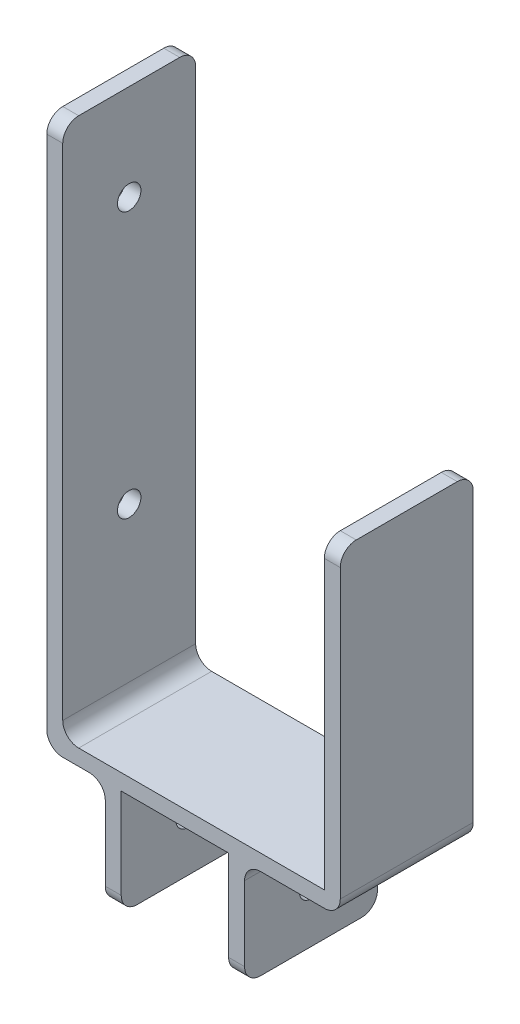
ISO-10303-21;
HEADER;
FILE_DESCRIPTION(('STEP AP214'),'2;1');
FILE_NAME('part.step','',(''),(''),'','','');
FILE_SCHEMA(('AUTOMOTIVE_DESIGN { 1 0 10303 214 1 1 1 1 }'));
ENDSEC;
DATA;
#1=APPLICATION_CONTEXT('core data for automotive mechanical design processes');
#2=APPLICATION_PROTOCOL_DEFINITION('international standard','automotive_design',2000,#1);
#3=PRODUCT_CONTEXT('',#1,'mechanical');
#4=PRODUCT('Part','Part','',(#3));
#5=PRODUCT_RELATED_PRODUCT_CATEGORY('part','',(#4));
#6=PRODUCT_DEFINITION_FORMATION('','',#4);
#7=PRODUCT_DEFINITION_CONTEXT('part definition',#1,'design');
#8=PRODUCT_DEFINITION('design','',#6,#7);
#9=PRODUCT_DEFINITION_SHAPE('','',#8);
#10=(LENGTH_UNIT() NAMED_UNIT(*) SI_UNIT(.MILLI.,.METRE.));
#11=(NAMED_UNIT(*) PLANE_ANGLE_UNIT() SI_UNIT($,.RADIAN.));
#12=(NAMED_UNIT(*) SI_UNIT($,.STERADIAN.) SOLID_ANGLE_UNIT());
#13=UNCERTAINTY_MEASURE_WITH_UNIT(LENGTH_MEASURE(1.E-05),#10,'distance_accuracy_value','');
#14=(GEOMETRIC_REPRESENTATION_CONTEXT(3) GLOBAL_UNCERTAINTY_ASSIGNED_CONTEXT((#13)) GLOBAL_UNIT_ASSIGNED_CONTEXT((#10,
#11,#12)) REPRESENTATION_CONTEXT('',''));
#15=CARTESIAN_POINT('',(0.,0.,0.));
#16=DIRECTION('',(0.,0.,1.));
#17=DIRECTION('',(1.,0.,0.));
#18=AXIS2_PLACEMENT_3D('',#15,#16,#17);
#19=CARTESIAN_POINT('',(-24.6,100.,25.));
#20=DIRECTION('',(-1.,0.,0.));
#21=DIRECTION('',(0.,-1.,0.));
#22=AXIS2_PLACEMENT_3D('',#19,#20,#21);
#23=PLANE('',#22);
#24=CARTESIAN_POINT('',(-24.6,32.,12.5));
#25=DIRECTION('',(-1.,0.,0.));
#26=DIRECTION('',(0.,-1.,0.));
#27=AXIS2_PLACEMENT_3D('',#24,#25,#26);
#28=CIRCLE('',#27,2.2);
#29=CARTESIAN_POINT('',(-24.6,29.8,12.5));
#30=VERTEX_POINT('',#29);
#31=EDGE_CURVE('E630',#30,#30,#28,.T.);
#32=ORIENTED_EDGE('',*,*,#31,.T.);
#33=EDGE_LOOP('',(#32));
#34=FACE_BOUND('',#33,.T.);
#35=CARTESIAN_POINT('',(-24.6,82.,12.5));
#36=DIRECTION('',(-1.,0.,0.));
#37=DIRECTION('',(0.,-1.,0.));
#38=AXIS2_PLACEMENT_3D('',#35,#36,#37);
#39=CIRCLE('',#38,2.2);
#40=CARTESIAN_POINT('',(-24.6,79.8,12.5));
#41=VERTEX_POINT('',#40);
#42=EDGE_CURVE('E276',#41,#41,#39,.T.);
#43=ORIENTED_EDGE('',*,*,#42,.T.);
#44=EDGE_LOOP('',(#43));
#45=FACE_BOUND('',#44,.T.);
#46=DIRECTION('',(0.,1.,0.));
#47=VECTOR('',#46,1.);
#48=CARTESIAN_POINT('',(-24.6,100.,25.));
#49=LINE('',#48,#47);
#50=CARTESIAN_POINT('',(-24.6,3.,25.));
#51=VERTEX_POINT('',#50);
#52=CARTESIAN_POINT('',(-24.6,97.,25.));
#53=VERTEX_POINT('',#52);
#54=EDGE_CURVE('E305',#51,#53,#49,.T.);
#55=ORIENTED_EDGE('',*,*,#54,.F.);
#56=DIRECTION('',(0.,0.,-1.));
#57=VECTOR('',#56,1.);
#58=CARTESIAN_POINT('',(-24.6,3.,0.));
#59=LINE('',#58,#57);
#60=CARTESIAN_POINT('',(-24.6,3.,0.));
#61=VERTEX_POINT('',#60);
#62=EDGE_CURVE('E414',#51,#61,#59,.T.);
#63=ORIENTED_EDGE('',*,*,#62,.T.);
#64=DIRECTION('',(0.,1.,0.));
#65=VECTOR('',#64,1.);
#66=CARTESIAN_POINT('',(-24.6,100.,0.));
#67=LINE('',#66,#65);
#68=CARTESIAN_POINT('',(-24.6,97.,0.));
#69=VERTEX_POINT('',#68);
#70=EDGE_CURVE('E272',#61,#69,#67,.T.);
#71=ORIENTED_EDGE('',*,*,#70,.T.);
#72=CARTESIAN_POINT('',(-24.6,97.,3.));
#73=DIRECTION('',(-1.,0.,0.));
#74=DIRECTION('',(0.,-1.,0.));
#75=AXIS2_PLACEMENT_3D('',#72,#73,#74);
#76=CIRCLE('',#75,3.);
#77=CARTESIAN_POINT('',(-24.6,100.,3.));
#78=VERTEX_POINT('',#77);
#79=EDGE_CURVE('E412',#69,#78,#76,.F.);
#80=ORIENTED_EDGE('',*,*,#79,.T.);
#81=DIRECTION('',(0.,0.,-1.));
#82=VECTOR('',#81,1.);
#83=CARTESIAN_POINT('',(-24.6,100.,25.));
#84=LINE('',#83,#82);
#85=CARTESIAN_POINT('',(-24.6,100.,22.));
#86=VERTEX_POINT('',#85);
#87=EDGE_CURVE('E327',#86,#78,#84,.T.);
#88=ORIENTED_EDGE('',*,*,#87,.F.);
#89=CARTESIAN_POINT('',(-24.6,97.,22.));
#90=DIRECTION('',(-1.,0.,0.));
#91=DIRECTION('',(0.,-1.,0.));
#92=AXIS2_PLACEMENT_3D('',#89,#90,#91);
#93=CIRCLE('',#92,3.);
#94=EDGE_CURVE('E410',#86,#53,#93,.F.);
#95=ORIENTED_EDGE('',*,*,#94,.T.);
#96=EDGE_LOOP('',(#55,#63,#71,#80,#88,#95));
#97=FACE_BOUND('',#96,.T.);
#98=ADVANCED_FACE('F32',(#34,#45,#97),#23,.F.);
#99=CARTESIAN_POINT('',(-27.6,100.,25.));
#100=DIRECTION('',(0.,-1.,0.));
#101=DIRECTION('',(0.,0.,-1.));
#102=AXIS2_PLACEMENT_3D('',#99,#100,#101);
#103=PLANE('',#102);
#104=ORIENTED_EDGE('',*,*,#87,.T.);
#105=DIRECTION('',(-1.,0.,0.));
#106=VECTOR('',#105,1.);
#107=CARTESIAN_POINT('',(-27.6,100.,3.));
#108=LINE('',#107,#106);
#109=CARTESIAN_POINT('',(-27.6,100.,3.));
#110=VERTEX_POINT('',#109);
#111=EDGE_CURVE('E427',#78,#110,#108,.T.);
#112=ORIENTED_EDGE('',*,*,#111,.T.);
#113=DIRECTION('',(0.,0.,-1.));
#114=VECTOR('',#113,1.);
#115=CARTESIAN_POINT('',(-27.6,100.,25.));
#116=LINE('',#115,#114);
#117=CARTESIAN_POINT('',(-27.6,100.,22.));
#118=VERTEX_POINT('',#117);
#119=EDGE_CURVE('E324',#118,#110,#116,.T.);
#120=ORIENTED_EDGE('',*,*,#119,.F.);
#121=DIRECTION('',(-1.,0.,0.));
#122=VECTOR('',#121,1.);
#123=CARTESIAN_POINT('',(-24.6,100.,22.));
#124=LINE('',#123,#122);
#125=EDGE_CURVE('E425',#118,#86,#124,.F.);
#126=ORIENTED_EDGE('',*,*,#125,.T.);
#127=EDGE_LOOP('',(#104,#112,#120,#126));
#128=FACE_BOUND('',#127,.T.);
#129=ADVANCED_FACE('F544',(#128),#103,.F.);
#130=CARTESIAN_POINT('',(-27.6,-3.,25.));
#131=DIRECTION('',(1.,0.,0.));
#132=DIRECTION('',(0.,1.,0.));
#133=AXIS2_PLACEMENT_3D('',#130,#131,#132);
#134=PLANE('',#133);
#135=CARTESIAN_POINT('',(-27.6,32.,12.5));
#136=DIRECTION('',(-1.,0.,0.));
#137=DIRECTION('',(0.,-1.,0.));
#138=AXIS2_PLACEMENT_3D('',#135,#136,#137);
#139=CIRCLE('',#138,2.2);
#140=CARTESIAN_POINT('',(-27.6,29.8,12.5));
#141=VERTEX_POINT('',#140);
#142=EDGE_CURVE('E625',#141,#141,#139,.T.);
#143=ORIENTED_EDGE('',*,*,#142,.F.);
#144=EDGE_LOOP('',(#143));
#145=FACE_BOUND('',#144,.T.);
#146=CARTESIAN_POINT('',(-27.6,82.,12.5));
#147=DIRECTION('',(-1.,0.,0.));
#148=DIRECTION('',(0.,-1.,0.));
#149=AXIS2_PLACEMENT_3D('',#146,#147,#148);
#150=CIRCLE('',#149,2.2);
#151=CARTESIAN_POINT('',(-27.6,79.8,12.5));
#152=VERTEX_POINT('',#151);
#153=EDGE_CURVE('E628',#152,#152,#150,.T.);
#154=ORIENTED_EDGE('',*,*,#153,.F.);
#155=EDGE_LOOP('',(#154));
#156=FACE_BOUND('',#155,.T.);
#157=DIRECTION('',(0.,-1.,0.));
#158=VECTOR('',#157,1.);
#159=CARTESIAN_POINT('',(-27.6,-3.,0.));
#160=LINE('',#159,#158);
#161=CARTESIAN_POINT('',(-27.6,97.,0.));
#162=VERTEX_POINT('',#161);
#163=CARTESIAN_POINT('',(-27.6,0.,0.));
#164=VERTEX_POINT('',#163);
#165=EDGE_CURVE('E275',#162,#164,#160,.T.);
#166=ORIENTED_EDGE('',*,*,#165,.T.);
#167=DIRECTION('',(0.,0.,-1.));
#168=VECTOR('',#167,1.);
#169=CARTESIAN_POINT('',(-27.6,0.,25.));
#170=LINE('',#169,#168);
#171=CARTESIAN_POINT('',(-27.6,0.,25.));
#172=VERTEX_POINT('',#171);
#173=EDGE_CURVE('E408',#164,#172,#170,.F.);
#174=ORIENTED_EDGE('',*,*,#173,.T.);
#175=DIRECTION('',(0.,-1.,0.));
#176=VECTOR('',#175,1.);
#177=CARTESIAN_POINT('',(-27.6,-3.,25.));
#178=LINE('',#177,#176);
#179=CARTESIAN_POINT('',(-27.6,97.,25.));
#180=VERTEX_POINT('',#179);
#181=EDGE_CURVE('E459',#180,#172,#178,.T.);
#182=ORIENTED_EDGE('',*,*,#181,.F.);
#183=CARTESIAN_POINT('',(-27.6,97.,22.));
#184=DIRECTION('',(1.,0.,0.));
#185=DIRECTION('',(0.,1.,0.));
#186=AXIS2_PLACEMENT_3D('',#183,#184,#185);
#187=CIRCLE('',#186,3.);
#188=EDGE_CURVE('E404',#180,#118,#187,.F.);
#189=ORIENTED_EDGE('',*,*,#188,.T.);
#190=ORIENTED_EDGE('',*,*,#119,.T.);
#191=CARTESIAN_POINT('',(-27.6,97.,3.));
#192=DIRECTION('',(1.,0.,0.));
#193=DIRECTION('',(0.,1.,0.));
#194=AXIS2_PLACEMENT_3D('',#191,#192,#193);
#195=CIRCLE('',#194,3.);
#196=EDGE_CURVE('E406',#110,#162,#195,.F.);
#197=ORIENTED_EDGE('',*,*,#196,.T.);
#198=EDGE_LOOP('',(#166,#174,#182,#189,#190,#197));
#199=FACE_BOUND('',#198,.T.);
#200=ADVANCED_FACE('F550',(#145,#156,#199),#134,.F.);
#201=CARTESIAN_POINT('',(-16.6,-3.,25.));
#202=DIRECTION('',(0.,1.,0.));
#203=DIRECTION('',(-1.,0.,0.));
#204=AXIS2_PLACEMENT_3D('',#201,#202,#203);
#205=PLANE('',#204);
#206=DIRECTION('',(1.,0.,0.));
#207=VECTOR('',#206,1.);
#208=CARTESIAN_POINT('',(-16.6,-3.,0.));
#209=LINE('',#208,#207);
#210=CARTESIAN_POINT('',(-24.6,-3.,0.));
#211=VERTEX_POINT('',#210);
#212=CARTESIAN_POINT('',(-19.6,-3.,0.));
#213=VERTEX_POINT('',#212);
#214=EDGE_CURVE('E279',#211,#213,#209,.T.);
#215=ORIENTED_EDGE('',*,*,#214,.T.);
#216=DIRECTION('',(0.,0.,-1.));
#217=VECTOR('',#216,1.);
#218=CARTESIAN_POINT('',(-19.6,-3.,25.));
#219=LINE('',#218,#217);
#220=CARTESIAN_POINT('',(-19.6,-3.,25.));
#221=VERTEX_POINT('',#220);
#222=EDGE_CURVE('E390',#213,#221,#219,.F.);
#223=ORIENTED_EDGE('',*,*,#222,.T.);
#224=DIRECTION('',(1.,0.,0.));
#225=VECTOR('',#224,1.);
#226=CARTESIAN_POINT('',(-16.6,-3.,25.));
#227=LINE('',#226,#225);
#228=CARTESIAN_POINT('',(-24.6,-3.,25.));
#229=VERTEX_POINT('',#228);
#230=EDGE_CURVE('E462',#229,#221,#227,.T.);
#231=ORIENTED_EDGE('',*,*,#230,.F.);
#232=DIRECTION('',(0.,0.,-1.));
#233=VECTOR('',#232,1.);
#234=CARTESIAN_POINT('',(-24.6,-3.,25.));
#235=LINE('',#234,#233);
#236=EDGE_CURVE('E387',#229,#211,#235,.T.);
#237=ORIENTED_EDGE('',*,*,#236,.T.);
#238=EDGE_LOOP('',(#215,#223,#231,#237));
#239=FACE_BOUND('',#238,.T.);
#240=ADVANCED_FACE('F603',(#239),#205,.F.);
#241=CARTESIAN_POINT('',(-16.6,-3.,25.));
#242=DIRECTION('',(1.,0.,0.));
#243=DIRECTION('',(0.,1.,0.));
#244=AXIS2_PLACEMENT_3D('',#241,#242,#243);
#245=PLANE('',#244);
#246=CARTESIAN_POINT('',(-16.6,-13.,12.5));
#247=DIRECTION('',(1.,0.,0.));
#248=DIRECTION('',(0.,1.,0.));
#249=AXIS2_PLACEMENT_3D('',#246,#247,#248);
#250=CIRCLE('',#249,2.2);
#251=CARTESIAN_POINT('',(-16.6,-10.8,12.5));
#252=VERTEX_POINT('',#251);
#253=EDGE_CURVE('E635',#252,#252,#250,.T.);
#254=ORIENTED_EDGE('',*,*,#253,.T.);
#255=EDGE_LOOP('',(#254));
#256=FACE_BOUND('',#255,.T.);
#257=DIRECTION('',(0.,-1.,0.));
#258=VECTOR('',#257,1.);
#259=CARTESIAN_POINT('',(-16.6,-3.,0.));
#260=LINE('',#259,#258);
#261=CARTESIAN_POINT('',(-16.6,-6.,0.));
#262=VERTEX_POINT('',#261);
#263=CARTESIAN_POINT('',(-16.6,-20.,0.));
#264=VERTEX_POINT('',#263);
#265=EDGE_CURVE('E282',#262,#264,#260,.T.);
#266=ORIENTED_EDGE('',*,*,#265,.T.);
#267=CARTESIAN_POINT('',(-16.6,-20.,3.));
#268=DIRECTION('',(1.,0.,0.));
#269=DIRECTION('',(0.,1.,0.));
#270=AXIS2_PLACEMENT_3D('',#267,#268,#269);
#271=CIRCLE('',#270,3.);
#272=CARTESIAN_POINT('',(-16.6,-23.,3.));
#273=VERTEX_POINT('',#272);
#274=EDGE_CURVE('E385',#264,#273,#271,.F.);
#275=ORIENTED_EDGE('',*,*,#274,.T.);
#276=DIRECTION('',(0.,0.,-1.));
#277=VECTOR('',#276,1.);
#278=CARTESIAN_POINT('',(-16.6,-23.,25.));
#279=LINE('',#278,#277);
#280=CARTESIAN_POINT('',(-16.6,-23.,22.));
#281=VERTEX_POINT('',#280);
#282=EDGE_CURVE('E321',#281,#273,#279,.T.);
#283=ORIENTED_EDGE('',*,*,#282,.F.);
#284=CARTESIAN_POINT('',(-16.6,-20.,22.));
#285=DIRECTION('',(1.,0.,0.));
#286=DIRECTION('',(0.,1.,0.));
#287=AXIS2_PLACEMENT_3D('',#284,#285,#286);
#288=CIRCLE('',#287,3.);
#289=CARTESIAN_POINT('',(-16.6,-20.,25.));
#290=VERTEX_POINT('',#289);
#291=EDGE_CURVE('E383',#281,#290,#288,.F.);
#292=ORIENTED_EDGE('',*,*,#291,.T.);
#293=DIRECTION('',(0.,-1.,0.));
#294=VECTOR('',#293,1.);
#295=CARTESIAN_POINT('',(-16.6,-3.,25.));
#296=LINE('',#295,#294);
#297=CARTESIAN_POINT('',(-16.6,-6.,25.));
#298=VERTEX_POINT('',#297);
#299=EDGE_CURVE('E236',#298,#290,#296,.T.);
#300=ORIENTED_EDGE('',*,*,#299,.F.);
#301=DIRECTION('',(0.,0.,-1.));
#302=VECTOR('',#301,1.);
#303=CARTESIAN_POINT('',(-16.6,-6.,0.));
#304=LINE('',#303,#302);
#305=EDGE_CURVE('E380',#298,#262,#304,.T.);
#306=ORIENTED_EDGE('',*,*,#305,.T.);
#307=EDGE_LOOP('',(#266,#275,#283,#292,#300,#306));
#308=FACE_BOUND('',#307,.T.);
#309=ADVANCED_FACE('F606',(#256,#308),#245,.F.);
#310=CARTESIAN_POINT('',(-16.6,-23.,25.));
#311=DIRECTION('',(0.,1.,0.));
#312=DIRECTION('',(-1.,0.,0.));
#313=AXIS2_PLACEMENT_3D('',#310,#311,#312);
#314=PLANE('',#313);
#315=ORIENTED_EDGE('',*,*,#282,.T.);
#316=DIRECTION('',(1.,0.,0.));
#317=VECTOR('',#316,1.);
#318=CARTESIAN_POINT('',(-16.6,-23.,3.));
#319=LINE('',#318,#317);
#320=CARTESIAN_POINT('',(-13.6,-23.,3.));
#321=VERTEX_POINT('',#320);
#322=EDGE_CURVE('E373',#273,#321,#319,.T.);
#323=ORIENTED_EDGE('',*,*,#322,.T.);
#324=DIRECTION('',(0.,0.,-1.));
#325=VECTOR('',#324,1.);
#326=CARTESIAN_POINT('',(-13.6,-23.,25.));
#327=LINE('',#326,#325);
#328=CARTESIAN_POINT('',(-13.6,-23.,22.));
#329=VERTEX_POINT('',#328);
#330=EDGE_CURVE('E246',#329,#321,#327,.T.);
#331=ORIENTED_EDGE('',*,*,#330,.F.);
#332=DIRECTION('',(1.,0.,0.));
#333=VECTOR('',#332,1.);
#334=CARTESIAN_POINT('',(-16.6,-23.,22.));
#335=LINE('',#334,#333);
#336=EDGE_CURVE('E371',#329,#281,#335,.F.);
#337=ORIENTED_EDGE('',*,*,#336,.T.);
#338=EDGE_LOOP('',(#315,#323,#331,#337));
#339=FACE_BOUND('',#338,.T.);
#340=ADVANCED_FACE('F478',(#339),#314,.F.);
#341=CARTESIAN_POINT('',(-13.6,-23.,25.));
#342=DIRECTION('',(-1.,0.,0.));
#343=DIRECTION('',(0.,-1.,0.));
#344=AXIS2_PLACEMENT_3D('',#341,#342,#343);
#345=PLANE('',#344);
#346=CARTESIAN_POINT('',(-13.6,-13.,12.5));
#347=DIRECTION('',(-1.,0.,0.));
#348=DIRECTION('',(0.,-1.,0.));
#349=AXIS2_PLACEMENT_3D('',#346,#347,#348);
#350=CIRCLE('',#349,2.2);
#351=CARTESIAN_POINT('',(-13.6,-15.2,12.5));
#352=VERTEX_POINT('',#351);
#353=EDGE_CURVE('E637',#352,#352,#350,.T.);
#354=ORIENTED_EDGE('',*,*,#353,.T.);
#355=EDGE_LOOP('',(#354));
#356=FACE_BOUND('',#355,.T.);
#357=ORIENTED_EDGE('',*,*,#330,.T.);
#358=CARTESIAN_POINT('',(-13.6,-20.,3.));
#359=DIRECTION('',(-1.,0.,0.));
#360=DIRECTION('',(0.,-1.,0.));
#361=AXIS2_PLACEMENT_3D('',#358,#359,#360);
#362=CIRCLE('',#361,3.);
#363=CARTESIAN_POINT('',(-13.6,-20.,0.));
#364=VERTEX_POINT('',#363);
#365=EDGE_CURVE('E378',#321,#364,#362,.F.);
#366=ORIENTED_EDGE('',*,*,#365,.T.);
#367=DIRECTION('',(0.,1.,0.));
#368=VECTOR('',#367,1.);
#369=CARTESIAN_POINT('',(-13.6,-23.,0.));
#370=LINE('',#369,#368);
#371=CARTESIAN_POINT('',(-13.6,-3.,0.));
#372=VERTEX_POINT('',#371);
#373=EDGE_CURVE('E243',#364,#372,#370,.T.);
#374=ORIENTED_EDGE('',*,*,#373,.T.);
#375=DIRECTION('',(0.,0.,-1.));
#376=VECTOR('',#375,1.);
#377=CARTESIAN_POINT('',(-13.6,-3.,25.));
#378=LINE('',#377,#376);
#379=CARTESIAN_POINT('',(-13.6,-3.,25.));
#380=VERTEX_POINT('',#379);
#381=EDGE_CURVE('E239',#380,#372,#378,.T.);
#382=ORIENTED_EDGE('',*,*,#381,.F.);
#383=DIRECTION('',(0.,1.,0.));
#384=VECTOR('',#383,1.);
#385=CARTESIAN_POINT('',(-13.6,-23.,25.));
#386=LINE('',#385,#384);
#387=CARTESIAN_POINT('',(-13.6,-20.,25.));
#388=VERTEX_POINT('',#387);
#389=EDGE_CURVE('E225',#388,#380,#386,.T.);
#390=ORIENTED_EDGE('',*,*,#389,.F.);
#391=CARTESIAN_POINT('',(-13.6,-20.,22.));
#392=DIRECTION('',(-1.,0.,0.));
#393=DIRECTION('',(0.,-1.,0.));
#394=AXIS2_PLACEMENT_3D('',#391,#392,#393);
#395=CIRCLE('',#394,3.);
#396=EDGE_CURVE('E376',#388,#329,#395,.F.);
#397=ORIENTED_EDGE('',*,*,#396,.T.);
#398=EDGE_LOOP('',(#357,#366,#374,#382,#390,#397));
#399=FACE_BOUND('',#398,.T.);
#400=ADVANCED_FACE('F241',(#356,#399),#345,.F.);
#401=CARTESIAN_POINT('',(6.59999999999999,-3.,25.));
#402=DIRECTION('',(0.,1.,0.));
#403=DIRECTION('',(-1.,0.,0.));
#404=AXIS2_PLACEMENT_3D('',#401,#402,#403);
#405=PLANE('',#404);
#406=DIRECTION('',(1.,0.,0.));
#407=VECTOR('',#406,1.);
#408=CARTESIAN_POINT('',(6.59999999999999,-3.,0.));
#409=LINE('',#408,#407);
#410=CARTESIAN_POINT('',(6.59999999999999,-3.,0.));
#411=VERTEX_POINT('',#410);
#412=EDGE_CURVE('E286',#372,#411,#409,.T.);
#413=ORIENTED_EDGE('',*,*,#412,.T.);
#414=DIRECTION('',(0.,0.,-1.));
#415=VECTOR('',#414,1.);
#416=CARTESIAN_POINT('',(6.59999999999999,-3.,25.));
#417=LINE('',#416,#415);
#418=CARTESIAN_POINT('',(6.59999999999999,-3.,25.));
#419=VERTEX_POINT('',#418);
#420=EDGE_CURVE('E247',#419,#411,#417,.T.);
#421=ORIENTED_EDGE('',*,*,#420,.F.);
#422=DIRECTION('',(1.,0.,0.));
#423=VECTOR('',#422,1.);
#424=CARTESIAN_POINT('',(6.59999999999999,-3.,25.));
#425=LINE('',#424,#423);
#426=EDGE_CURVE('E230',#380,#419,#425,.T.);
#427=ORIENTED_EDGE('',*,*,#426,.F.);
#428=ORIENTED_EDGE('',*,*,#381,.T.);
#429=EDGE_LOOP('',(#413,#421,#427,#428));
#430=FACE_BOUND('',#429,.T.);
#431=ADVANCED_FACE('F249',(#430),#405,.F.);
#432=CARTESIAN_POINT('',(6.59999999999999,-3.,25.));
#433=DIRECTION('',(1.,0.,0.));
#434=DIRECTION('',(0.,1.,0.));
#435=AXIS2_PLACEMENT_3D('',#432,#433,#434);
#436=PLANE('',#435);
#437=CARTESIAN_POINT('',(6.59999999999999,-13.,12.5));
#438=DIRECTION('',(1.,0.,0.));
#439=DIRECTION('',(0.,1.,0.));
#440=AXIS2_PLACEMENT_3D('',#437,#438,#439);
#441=CIRCLE('',#440,2.2);
#442=CARTESIAN_POINT('',(6.59999999999999,-10.8,12.5));
#443=VERTEX_POINT('',#442);
#444=EDGE_CURVE('E640',#443,#443,#441,.T.);
#445=ORIENTED_EDGE('',*,*,#444,.T.);
#446=EDGE_LOOP('',(#445));
#447=FACE_BOUND('',#446,.T.);
#448=DIRECTION('',(0.,0.,-1.));
#449=VECTOR('',#448,1.);
#450=CARTESIAN_POINT('',(6.6,-23.,25.));
#451=LINE('',#450,#449);
#452=CARTESIAN_POINT('',(6.6,-23.,22.));
#453=VERTEX_POINT('',#452);
#454=CARTESIAN_POINT('',(6.6,-23.,3.));
#455=VERTEX_POINT('',#454);
#456=EDGE_CURVE('E316',#453,#455,#451,.T.);
#457=ORIENTED_EDGE('',*,*,#456,.F.);
#458=CARTESIAN_POINT('',(6.6,-20.,22.));
#459=DIRECTION('',(1.,0.,0.));
#460=DIRECTION('',(0.,1.,0.));
#461=AXIS2_PLACEMENT_3D('',#458,#459,#460);
#462=CIRCLE('',#461,3.);
#463=CARTESIAN_POINT('',(6.6,-20.,25.));
#464=VERTEX_POINT('',#463);
#465=EDGE_CURVE('E357',#453,#464,#462,.F.);
#466=ORIENTED_EDGE('',*,*,#465,.T.);
#467=DIRECTION('',(0.,-1.,0.));
#468=VECTOR('',#467,1.);
#469=CARTESIAN_POINT('',(6.59999999999999,-3.,25.));
#470=LINE('',#469,#468);
#471=EDGE_CURVE('E252',#419,#464,#470,.T.);
#472=ORIENTED_EDGE('',*,*,#471,.F.);
#473=ORIENTED_EDGE('',*,*,#420,.T.);
#474=DIRECTION('',(0.,-1.,0.));
#475=VECTOR('',#474,1.);
#476=CARTESIAN_POINT('',(6.59999999999999,-3.,0.));
#477=LINE('',#476,#475);
#478=CARTESIAN_POINT('',(6.6,-20.,0.));
#479=VERTEX_POINT('',#478);
#480=EDGE_CURVE('E288',#411,#479,#477,.T.);
#481=ORIENTED_EDGE('',*,*,#480,.T.);
#482=CARTESIAN_POINT('',(6.6,-20.,3.));
#483=DIRECTION('',(1.,0.,0.));
#484=DIRECTION('',(0.,1.,0.));
#485=AXIS2_PLACEMENT_3D('',#482,#483,#484);
#486=CIRCLE('',#485,3.);
#487=EDGE_CURVE('E355',#479,#455,#486,.F.);
#488=ORIENTED_EDGE('',*,*,#487,.T.);
#489=EDGE_LOOP('',(#457,#466,#472,#473,#481,#488));
#490=FACE_BOUND('',#489,.T.);
#491=ADVANCED_FACE('F489',(#447,#490),#436,.F.);
#492=CARTESIAN_POINT('',(6.6,-23.,25.));
#493=DIRECTION('',(0.,1.,0.));
#494=DIRECTION('',(0.,0.,1.));
#495=AXIS2_PLACEMENT_3D('',#492,#493,#494);
#496=PLANE('',#495);
#497=DIRECTION('',(0.,0.,-1.));
#498=VECTOR('',#497,1.);
#499=CARTESIAN_POINT('',(9.6,-23.,25.));
#500=LINE('',#499,#498);
#501=CARTESIAN_POINT('',(9.6,-23.,22.));
#502=VERTEX_POINT('',#501);
#503=CARTESIAN_POINT('',(9.6,-23.,3.));
#504=VERTEX_POINT('',#503);
#505=EDGE_CURVE('E313',#502,#504,#500,.T.);
#506=ORIENTED_EDGE('',*,*,#505,.F.);
#507=DIRECTION('',(1.,0.,0.));
#508=VECTOR('',#507,1.);
#509=CARTESIAN_POINT('',(6.6,-23.,22.));
#510=LINE('',#509,#508);
#511=EDGE_CURVE('E353',#502,#453,#510,.F.);
#512=ORIENTED_EDGE('',*,*,#511,.T.);
#513=ORIENTED_EDGE('',*,*,#456,.T.);
#514=DIRECTION('',(1.,0.,0.));
#515=VECTOR('',#514,1.);
#516=CARTESIAN_POINT('',(6.6,-23.,3.));
#517=LINE('',#516,#515);
#518=EDGE_CURVE('E350',#455,#504,#517,.T.);
#519=ORIENTED_EDGE('',*,*,#518,.T.);
#520=EDGE_LOOP('',(#506,#512,#513,#519));
#521=FACE_BOUND('',#520,.T.);
#522=ADVANCED_FACE('F501',(#521),#496,.F.);
#523=CARTESIAN_POINT('',(9.6,-23.,25.));
#524=DIRECTION('',(-1.,0.,0.));
#525=DIRECTION('',(0.,-1.,0.));
#526=AXIS2_PLACEMENT_3D('',#523,#524,#525);
#527=PLANE('',#526);
#528=CARTESIAN_POINT('',(9.6,-13.,12.5));
#529=DIRECTION('',(-1.,0.,0.));
#530=DIRECTION('',(0.,-1.,0.));
#531=AXIS2_PLACEMENT_3D('',#528,#529,#530);
#532=CIRCLE('',#531,2.2);
#533=CARTESIAN_POINT('',(9.6,-15.2,12.5));
#534=VERTEX_POINT('',#533);
#535=EDGE_CURVE('E36',#534,#534,#532,.T.);
#536=ORIENTED_EDGE('',*,*,#535,.T.);
#537=EDGE_LOOP('',(#536));
#538=FACE_BOUND('',#537,.T.);
#539=DIRECTION('',(0.,1.,0.));
#540=VECTOR('',#539,1.);
#541=CARTESIAN_POINT('',(9.6,-23.,25.));
#542=LINE('',#541,#540);
#543=CARTESIAN_POINT('',(9.6,-20.,25.));
#544=VERTEX_POINT('',#543);
#545=CARTESIAN_POINT('',(9.59999999999999,-6.,25.));
#546=VERTEX_POINT('',#545);
#547=EDGE_CURVE('E254',#544,#546,#542,.T.);
#548=ORIENTED_EDGE('',*,*,#547,.F.);
#549=CARTESIAN_POINT('',(9.6,-20.,22.));
#550=DIRECTION('',(-1.,0.,0.));
#551=DIRECTION('',(0.,-1.,0.));
#552=AXIS2_PLACEMENT_3D('',#549,#550,#551);
#553=CIRCLE('',#552,3.);
#554=EDGE_CURVE('E348',#544,#502,#553,.F.);
#555=ORIENTED_EDGE('',*,*,#554,.T.);
#556=ORIENTED_EDGE('',*,*,#505,.T.);
#557=CARTESIAN_POINT('',(9.6,-20.,3.));
#558=DIRECTION('',(-1.,0.,0.));
#559=DIRECTION('',(0.,-1.,0.));
#560=AXIS2_PLACEMENT_3D('',#557,#558,#559);
#561=CIRCLE('',#560,3.);
#562=CARTESIAN_POINT('',(9.6,-20.,0.));
#563=VERTEX_POINT('',#562);
#564=EDGE_CURVE('E346',#504,#563,#561,.F.);
#565=ORIENTED_EDGE('',*,*,#564,.T.);
#566=DIRECTION('',(0.,1.,0.));
#567=VECTOR('',#566,1.);
#568=CARTESIAN_POINT('',(9.6,-23.,0.));
#569=LINE('',#568,#567);
#570=CARTESIAN_POINT('',(9.59999999999999,-6.,0.));
#571=VERTEX_POINT('',#570);
#572=EDGE_CURVE('E291',#563,#571,#569,.T.);
#573=ORIENTED_EDGE('',*,*,#572,.T.);
#574=DIRECTION('',(0.,0.,-1.));
#575=VECTOR('',#574,1.);
#576=CARTESIAN_POINT('',(9.59999999999999,-6.,25.));
#577=LINE('',#576,#575);
#578=EDGE_CURVE('E344',#571,#546,#577,.F.);
#579=ORIENTED_EDGE('',*,*,#578,.T.);
#580=EDGE_LOOP('',(#548,#555,#556,#565,#573,#579));
#581=FACE_BOUND('',#580,.T.);
#582=ADVANCED_FACE('F499',(#538,#581),#527,.F.);
#583=CARTESIAN_POINT('',(27.6,-3.,25.));
#584=DIRECTION('',(0.,1.,0.));
#585=DIRECTION('',(-1.,0.,0.));
#586=AXIS2_PLACEMENT_3D('',#583,#584,#585);
#587=PLANE('',#586);
#588=DIRECTION('',(1.,0.,0.));
#589=VECTOR('',#588,1.);
#590=CARTESIAN_POINT('',(27.6,-3.,25.));
#591=LINE('',#590,#589);
#592=CARTESIAN_POINT('',(12.6,-3.,25.));
#593=VERTEX_POINT('',#592);
#594=CARTESIAN_POINT('',(24.6,-3.,25.));
#595=VERTEX_POINT('',#594);
#596=EDGE_CURVE('E260',#593,#595,#591,.T.);
#597=ORIENTED_EDGE('',*,*,#596,.F.);
#598=DIRECTION('',(0.,0.,-1.));
#599=VECTOR('',#598,1.);
#600=CARTESIAN_POINT('',(12.6,-3.,0.));
#601=LINE('',#600,#599);
#602=CARTESIAN_POINT('',(12.6,-3.,0.));
#603=VERTEX_POINT('',#602);
#604=EDGE_CURVE('E394',#593,#603,#601,.T.);
#605=ORIENTED_EDGE('',*,*,#604,.T.);
#606=DIRECTION('',(1.,0.,0.));
#607=VECTOR('',#606,1.);
#608=CARTESIAN_POINT('',(27.6,-3.,0.));
#609=LINE('',#608,#607);
#610=CARTESIAN_POINT('',(24.6,-3.,0.));
#611=VERTEX_POINT('',#610);
#612=EDGE_CURVE('E294',#603,#611,#609,.T.);
#613=ORIENTED_EDGE('',*,*,#612,.T.);
#614=DIRECTION('',(0.,0.,-1.));
#615=VECTOR('',#614,1.);
#616=CARTESIAN_POINT('',(24.6,-3.,25.));
#617=LINE('',#616,#615);
#618=EDGE_CURVE('E392',#611,#595,#617,.F.);
#619=ORIENTED_EDGE('',*,*,#618,.T.);
#620=EDGE_LOOP('',(#597,#605,#613,#619));
#621=FACE_BOUND('',#620,.T.);
#622=ADVANCED_FACE('F514',(#621),#587,.F.);
#623=CARTESIAN_POINT('',(27.6,57.,25.));
#624=DIRECTION('',(-1.,0.,0.));
#625=DIRECTION('',(0.,-1.,0.));
#626=AXIS2_PLACEMENT_3D('',#623,#624,#625);
#627=PLANE('',#626);
#628=DIRECTION('',(0.,1.,0.));
#629=VECTOR('',#628,1.);
#630=CARTESIAN_POINT('',(27.6,57.,25.));
#631=LINE('',#630,#629);
#632=CARTESIAN_POINT('',(27.6,0.,25.));
#633=VERTEX_POINT('',#632);
#634=CARTESIAN_POINT('',(27.6,54.,25.));
#635=VERTEX_POINT('',#634);
#636=EDGE_CURVE('E263',#633,#635,#631,.T.);
#637=ORIENTED_EDGE('',*,*,#636,.F.);
#638=DIRECTION('',(0.,0.,-1.));
#639=VECTOR('',#638,1.);
#640=CARTESIAN_POINT('',(27.6,0.,25.));
#641=LINE('',#640,#639);
#642=CARTESIAN_POINT('',(27.6,0.,0.));
#643=VERTEX_POINT('',#642);
#644=EDGE_CURVE('E401',#633,#643,#641,.T.);
#645=ORIENTED_EDGE('',*,*,#644,.T.);
#646=DIRECTION('',(0.,1.,0.));
#647=VECTOR('',#646,1.);
#648=CARTESIAN_POINT('',(27.6,57.,0.));
#649=LINE('',#648,#647);
#650=CARTESIAN_POINT('',(27.6,54.,0.));
#651=VERTEX_POINT('',#650);
#652=EDGE_CURVE('E297',#643,#651,#649,.T.);
#653=ORIENTED_EDGE('',*,*,#652,.T.);
#654=CARTESIAN_POINT('',(27.6,54.,3.));
#655=DIRECTION('',(-1.,0.,0.));
#656=DIRECTION('',(0.,-1.,0.));
#657=AXIS2_PLACEMENT_3D('',#654,#655,#656);
#658=CIRCLE('',#657,3.);
#659=CARTESIAN_POINT('',(27.6,57.,3.));
#660=VERTEX_POINT('',#659);
#661=EDGE_CURVE('E399',#651,#660,#658,.F.);
#662=ORIENTED_EDGE('',*,*,#661,.T.);
#663=DIRECTION('',(0.,0.,-1.));
#664=VECTOR('',#663,1.);
#665=CARTESIAN_POINT('',(27.6,57.,25.));
#666=LINE('',#665,#664);
#667=CARTESIAN_POINT('',(27.6,57.,22.));
#668=VERTEX_POINT('',#667);
#669=EDGE_CURVE('E310',#668,#660,#666,.T.);
#670=ORIENTED_EDGE('',*,*,#669,.F.);
#671=CARTESIAN_POINT('',(27.6,54.,22.));
#672=DIRECTION('',(-1.,0.,0.));
#673=DIRECTION('',(0.,-1.,0.));
#674=AXIS2_PLACEMENT_3D('',#671,#672,#673);
#675=CIRCLE('',#674,3.);
#676=EDGE_CURVE('E397',#668,#635,#675,.F.);
#677=ORIENTED_EDGE('',*,*,#676,.T.);
#678=EDGE_LOOP('',(#637,#645,#653,#662,#670,#677));
#679=FACE_BOUND('',#678,.T.);
#680=ADVANCED_FACE('F523',(#679),#627,.F.);
#681=CARTESIAN_POINT('',(24.6,57.,25.));
#682=DIRECTION('',(0.,-1.,0.));
#683=DIRECTION('',(0.,0.,-1.));
#684=AXIS2_PLACEMENT_3D('',#681,#682,#683);
#685=PLANE('',#684);
#686=ORIENTED_EDGE('',*,*,#669,.T.);
#687=DIRECTION('',(-1.,0.,0.));
#688=VECTOR('',#687,1.);
#689=CARTESIAN_POINT('',(24.6,57.,3.));
#690=LINE('',#689,#688);
#691=CARTESIAN_POINT('',(24.6,57.,3.));
#692=VERTEX_POINT('',#691);
#693=EDGE_CURVE('E421',#660,#692,#690,.T.);
#694=ORIENTED_EDGE('',*,*,#693,.T.);
#695=DIRECTION('',(0.,0.,-1.));
#696=VECTOR('',#695,1.);
#697=CARTESIAN_POINT('',(24.6,57.,25.));
#698=LINE('',#697,#696);
#699=CARTESIAN_POINT('',(24.6,57.,22.));
#700=VERTEX_POINT('',#699);
#701=EDGE_CURVE('E308',#700,#692,#698,.T.);
#702=ORIENTED_EDGE('',*,*,#701,.F.);
#703=DIRECTION('',(-1.,0.,0.));
#704=VECTOR('',#703,1.);
#705=CARTESIAN_POINT('',(27.6,57.,22.));
#706=LINE('',#705,#704);
#707=EDGE_CURVE('E419',#700,#668,#706,.F.);
#708=ORIENTED_EDGE('',*,*,#707,.T.);
#709=EDGE_LOOP('',(#686,#694,#702,#708));
#710=FACE_BOUND('',#709,.T.);
#711=ADVANCED_FACE('F529',(#710),#685,.F.);
#712=CARTESIAN_POINT('',(24.6,0.,25.));
#713=DIRECTION('',(1.,0.,0.));
#714=DIRECTION('',(0.,1.,0.));
#715=AXIS2_PLACEMENT_3D('',#712,#713,#714);
#716=PLANE('',#715);
#717=ORIENTED_EDGE('',*,*,#701,.T.);
#718=CARTESIAN_POINT('',(24.6,54.,3.));
#719=DIRECTION('',(1.,0.,0.));
#720=DIRECTION('',(0.,1.,0.));
#721=AXIS2_PLACEMENT_3D('',#718,#719,#720);
#722=CIRCLE('',#721,3.);
#723=CARTESIAN_POINT('',(24.6,54.,0.));
#724=VERTEX_POINT('',#723);
#725=EDGE_CURVE('E48',#692,#724,#722,.F.);
#726=ORIENTED_EDGE('',*,*,#725,.T.);
#727=DIRECTION('',(0.,-1.,0.));
#728=VECTOR('',#727,1.);
#729=CARTESIAN_POINT('',(24.6,0.,0.));
#730=LINE('',#729,#728);
#731=CARTESIAN_POINT('',(24.6,0.,0.));
#732=VERTEX_POINT('',#731);
#733=EDGE_CURVE('E300',#724,#732,#730,.T.);
#734=ORIENTED_EDGE('',*,*,#733,.T.);
#735=DIRECTION('',(0.,0.,-1.));
#736=VECTOR('',#735,1.);
#737=CARTESIAN_POINT('',(24.6,0.,25.));
#738=LINE('',#737,#736);
#739=CARTESIAN_POINT('',(24.6,0.,25.));
#740=VERTEX_POINT('',#739);
#741=EDGE_CURVE('E271',#740,#732,#738,.T.);
#742=ORIENTED_EDGE('',*,*,#741,.F.);
#743=DIRECTION('',(0.,-1.,0.));
#744=VECTOR('',#743,1.);
#745=CARTESIAN_POINT('',(24.6,0.,25.));
#746=LINE('',#745,#744);
#747=CARTESIAN_POINT('',(24.6,54.,25.));
#748=VERTEX_POINT('',#747);
#749=EDGE_CURVE('E266',#748,#740,#746,.T.);
#750=ORIENTED_EDGE('',*,*,#749,.F.);
#751=CARTESIAN_POINT('',(24.6,54.,22.));
#752=DIRECTION('',(1.,0.,0.));
#753=DIRECTION('',(0.,1.,0.));
#754=AXIS2_PLACEMENT_3D('',#751,#752,#753);
#755=CIRCLE('',#754,3.);
#756=EDGE_CURVE('E56',#748,#700,#755,.F.);
#757=ORIENTED_EDGE('',*,*,#756,.T.);
#758=EDGE_LOOP('',(#717,#726,#734,#742,#750,#757));
#759=FACE_BOUND('',#758,.T.);
#760=ADVANCED_FACE('F534',(#759),#716,.F.);
#761=CARTESIAN_POINT('',(-24.6,0.,25.));
#762=DIRECTION('',(0.,-1.,0.));
#763=DIRECTION('',(0.,0.,-1.));
#764=AXIS2_PLACEMENT_3D('',#761,#762,#763);
#765=PLANE('',#764);
#766=DIRECTION('',(-1.,0.,0.));
#767=VECTOR('',#766,1.);
#768=CARTESIAN_POINT('',(-24.6,0.,0.));
#769=LINE('',#768,#767);
#770=CARTESIAN_POINT('',(-21.6,0.,0.));
#771=VERTEX_POINT('',#770);
#772=EDGE_CURVE('E302',#732,#771,#769,.T.);
#773=ORIENTED_EDGE('',*,*,#772,.T.);
#774=DIRECTION('',(0.,0.,-1.));
#775=VECTOR('',#774,1.);
#776=CARTESIAN_POINT('',(-21.6,0.,25.));
#777=LINE('',#776,#775);
#778=CARTESIAN_POINT('',(-21.6,0.,25.));
#779=VERTEX_POINT('',#778);
#780=EDGE_CURVE('E417',#771,#779,#777,.F.);
#781=ORIENTED_EDGE('',*,*,#780,.T.);
#782=DIRECTION('',(-1.,0.,0.));
#783=VECTOR('',#782,1.);
#784=CARTESIAN_POINT('',(-24.6,0.,25.));
#785=LINE('',#784,#783);
#786=EDGE_CURVE('E268',#740,#779,#785,.T.);
#787=ORIENTED_EDGE('',*,*,#786,.F.);
#788=ORIENTED_EDGE('',*,*,#741,.T.);
#789=EDGE_LOOP('',(#773,#781,#787,#788));
#790=FACE_BOUND('',#789,.T.);
#791=ADVANCED_FACE('F448',(#790),#765,.F.);
#792=CARTESIAN_POINT('',(0.,0.,25.));
#793=DIRECTION('',(0.,0.,1.));
#794=DIRECTION('',(1.,0.,0.));
#795=AXIS2_PLACEMENT_3D('',#792,#793,#794);
#796=PLANE('',#795);
#797=ORIENTED_EDGE('',*,*,#471,.T.);
#798=DIRECTION('',(1.,0.,0.));
#799=VECTOR('',#798,1.);
#800=CARTESIAN_POINT('',(9.6,-20.,25.));
#801=LINE('',#800,#799);
#802=EDGE_CURVE('E341',#464,#544,#801,.T.);
#803=ORIENTED_EDGE('',*,*,#802,.T.);
#804=ORIENTED_EDGE('',*,*,#547,.T.);
#805=CARTESIAN_POINT('',(12.6,-6.,25.));
#806=DIRECTION('',(0.,0.,1.));
#807=DIRECTION('',(1.,0.,0.));
#808=AXIS2_PLACEMENT_3D('',#805,#806,#807);
#809=CIRCLE('',#808,3.);
#810=EDGE_CURVE('E436',#546,#593,#809,.F.);
#811=ORIENTED_EDGE('',*,*,#810,.T.);
#812=ORIENTED_EDGE('',*,*,#596,.T.);
#813=CARTESIAN_POINT('',(24.6,0.,25.));
#814=DIRECTION('',(0.,0.,1.));
#815=DIRECTION('',(1.,0.,0.));
#816=AXIS2_PLACEMENT_3D('',#813,#814,#815);
#817=CIRCLE('',#816,3.);
#818=EDGE_CURVE('E338',#595,#633,#817,.T.);
#819=ORIENTED_EDGE('',*,*,#818,.T.);
#820=ORIENTED_EDGE('',*,*,#636,.T.);
#821=DIRECTION('',(-1.,0.,0.));
#822=VECTOR('',#821,1.);
#823=CARTESIAN_POINT('',(24.6,54.,25.));
#824=LINE('',#823,#822);
#825=EDGE_CURVE('E333',#635,#748,#824,.T.);
#826=ORIENTED_EDGE('',*,*,#825,.T.);
#827=ORIENTED_EDGE('',*,*,#749,.T.);
#828=ORIENTED_EDGE('',*,*,#786,.T.);
#829=CARTESIAN_POINT('',(-21.6,3.,25.));
#830=DIRECTION('',(0.,0.,1.));
#831=DIRECTION('',(1.,0.,0.));
#832=AXIS2_PLACEMENT_3D('',#829,#830,#831);
#833=CIRCLE('',#832,3.);
#834=EDGE_CURVE('E11',#779,#51,#833,.F.);
#835=ORIENTED_EDGE('',*,*,#834,.T.);
#836=ORIENTED_EDGE('',*,*,#54,.T.);
#837=DIRECTION('',(-1.,0.,0.));
#838=VECTOR('',#837,1.);
#839=CARTESIAN_POINT('',(-27.6,97.,25.));
#840=LINE('',#839,#838);
#841=EDGE_CURVE('E330',#53,#180,#840,.T.);
#842=ORIENTED_EDGE('',*,*,#841,.T.);
#843=ORIENTED_EDGE('',*,*,#181,.T.);
#844=CARTESIAN_POINT('',(-24.6,0.,25.));
#845=DIRECTION('',(0.,0.,1.));
#846=DIRECTION('',(1.,0.,0.));
#847=AXIS2_PLACEMENT_3D('',#844,#845,#846);
#848=CIRCLE('',#847,3.);
#849=EDGE_CURVE('E336',#172,#229,#848,.T.);
#850=ORIENTED_EDGE('',*,*,#849,.T.);
#851=ORIENTED_EDGE('',*,*,#230,.T.);
#852=CARTESIAN_POINT('',(-19.6,-6.,25.));
#853=DIRECTION('',(0.,0.,1.));
#854=DIRECTION('',(1.,0.,0.));
#855=AXIS2_PLACEMENT_3D('',#852,#853,#854);
#856=CIRCLE('',#855,3.);
#857=EDGE_CURVE('E432',#221,#298,#856,.F.);
#858=ORIENTED_EDGE('',*,*,#857,.T.);
#859=ORIENTED_EDGE('',*,*,#299,.T.);
#860=DIRECTION('',(1.,0.,0.));
#861=VECTOR('',#860,1.);
#862=CARTESIAN_POINT('',(-13.6,-20.,25.));
#863=LINE('',#862,#861);
#864=EDGE_CURVE('E234',#290,#388,#863,.T.);
#865=ORIENTED_EDGE('',*,*,#864,.T.);
#866=ORIENTED_EDGE('',*,*,#389,.T.);
#867=ORIENTED_EDGE('',*,*,#426,.T.);
#868=EDGE_LOOP('',(#797,#803,#804,#811,#812,#819,#820,#826,#827,#828,#835,#836,#842,#843,#850,
#851,#858,#859,#865,#866,#867));
#869=FACE_BOUND('',#868,.T.);
#870=ADVANCED_FACE('F228',(#869),#796,.T.);
#871=CARTESIAN_POINT('',(0.,0.,0.));
#872=DIRECTION('',(0.,0.,1.));
#873=DIRECTION('',(1.,0.,0.));
#874=AXIS2_PLACEMENT_3D('',#871,#872,#873);
#875=PLANE('',#874);
#876=ORIENTED_EDGE('',*,*,#572,.F.);
#877=DIRECTION('',(1.,0.,0.));
#878=VECTOR('',#877,1.);
#879=CARTESIAN_POINT('',(0.,-20.,0.));
#880=LINE('',#879,#878);
#881=EDGE_CURVE('E369',#563,#479,#880,.F.);
#882=ORIENTED_EDGE('',*,*,#881,.T.);
#883=ORIENTED_EDGE('',*,*,#480,.F.);
#884=ORIENTED_EDGE('',*,*,#412,.F.);
#885=ORIENTED_EDGE('',*,*,#373,.F.);
#886=DIRECTION('',(1.,0.,0.));
#887=VECTOR('',#886,1.);
#888=CARTESIAN_POINT('',(0.,-20.,0.));
#889=LINE('',#888,#887);
#890=EDGE_CURVE('E367',#364,#264,#889,.F.);
#891=ORIENTED_EDGE('',*,*,#890,.T.);
#892=ORIENTED_EDGE('',*,*,#265,.F.);
#893=CARTESIAN_POINT('',(-19.6,-6.,0.));
#894=DIRECTION('',(0.,0.,1.));
#895=DIRECTION('',(1.,0.,0.));
#896=AXIS2_PLACEMENT_3D('',#893,#894,#895);
#897=CIRCLE('',#896,3.);
#898=EDGE_CURVE('E430',#262,#213,#897,.T.);
#899=ORIENTED_EDGE('',*,*,#898,.T.);
#900=ORIENTED_EDGE('',*,*,#214,.F.);
#901=CARTESIAN_POINT('',(-24.6,0.,0.));
#902=DIRECTION('',(0.,0.,1.));
#903=DIRECTION('',(1.,0.,0.));
#904=AXIS2_PLACEMENT_3D('',#901,#902,#903);
#905=CIRCLE('',#904,3.);
#906=EDGE_CURVE('E363',#211,#164,#905,.F.);
#907=ORIENTED_EDGE('',*,*,#906,.T.);
#908=ORIENTED_EDGE('',*,*,#165,.F.);
#909=DIRECTION('',(-1.,0.,0.));
#910=VECTOR('',#909,1.);
#911=CARTESIAN_POINT('',(0.,97.,0.));
#912=LINE('',#911,#910);
#913=EDGE_CURVE('E359',#162,#69,#912,.F.);
#914=ORIENTED_EDGE('',*,*,#913,.T.);
#915=ORIENTED_EDGE('',*,*,#70,.F.);
#916=CARTESIAN_POINT('',(-21.6,3.,0.));
#917=DIRECTION('',(0.,0.,1.));
#918=DIRECTION('',(1.,0.,0.));
#919=AXIS2_PLACEMENT_3D('',#916,#917,#918);
#920=CIRCLE('',#919,3.);
#921=EDGE_CURVE('E41',#61,#771,#920,.T.);
#922=ORIENTED_EDGE('',*,*,#921,.T.);
#923=ORIENTED_EDGE('',*,*,#772,.F.);
#924=ORIENTED_EDGE('',*,*,#733,.F.);
#925=DIRECTION('',(-1.,0.,0.));
#926=VECTOR('',#925,1.);
#927=CARTESIAN_POINT('',(0.,54.,0.));
#928=LINE('',#927,#926);
#929=EDGE_CURVE('E361',#724,#651,#928,.F.);
#930=ORIENTED_EDGE('',*,*,#929,.T.);
#931=ORIENTED_EDGE('',*,*,#652,.F.);
#932=CARTESIAN_POINT('',(24.6,0.,0.));
#933=DIRECTION('',(0.,0.,1.));
#934=DIRECTION('',(1.,0.,0.));
#935=AXIS2_PLACEMENT_3D('',#932,#933,#934);
#936=CIRCLE('',#935,3.);
#937=EDGE_CURVE('E365',#643,#611,#936,.F.);
#938=ORIENTED_EDGE('',*,*,#937,.T.);
#939=ORIENTED_EDGE('',*,*,#612,.F.);
#940=CARTESIAN_POINT('',(12.6,-6.,0.));
#941=DIRECTION('',(0.,0.,1.));
#942=DIRECTION('',(1.,0.,0.));
#943=AXIS2_PLACEMENT_3D('',#940,#941,#942);
#944=CIRCLE('',#943,3.);
#945=EDGE_CURVE('E434',#603,#571,#944,.T.);
#946=ORIENTED_EDGE('',*,*,#945,.T.);
#947=EDGE_LOOP('',(#876,#882,#883,#884,#885,#891,#892,#899,#900,#907,#908,#914,#915,#922,#923,
#924,#930,#931,#938,#939,#946));
#948=FACE_BOUND('',#947,.T.);
#949=ADVANCED_FACE('F442',(#948),#875,.F.);
#950=CARTESIAN_POINT('',(0.,-20.,22.));
#951=DIRECTION('',(-1.,0.,0.));
#952=DIRECTION('',(0.,0.,1.));
#953=AXIS2_PLACEMENT_3D('',#950,#951,#952);
#954=CYLINDRICAL_SURFACE('',#953,3.);
#955=ORIENTED_EDGE('',*,*,#465,.F.);
#956=ORIENTED_EDGE('',*,*,#511,.F.);
#957=ORIENTED_EDGE('',*,*,#554,.F.);
#958=ORIENTED_EDGE('',*,*,#802,.F.);
#959=EDGE_LOOP('',(#955,#956,#957,#958));
#960=FACE_BOUND('',#959,.T.);
#961=ADVANCED_FACE('F495',(#960),#954,.T.);
#962=CARTESIAN_POINT('',(6.6,-20.,3.));
#963=DIRECTION('',(1.,0.,0.));
#964=DIRECTION('',(0.,0.,-1.));
#965=AXIS2_PLACEMENT_3D('',#962,#963,#964);
#966=CYLINDRICAL_SURFACE('',#965,3.);
#967=ORIENTED_EDGE('',*,*,#487,.F.);
#968=ORIENTED_EDGE('',*,*,#881,.F.);
#969=ORIENTED_EDGE('',*,*,#564,.F.);
#970=ORIENTED_EDGE('',*,*,#518,.F.);
#971=EDGE_LOOP('',(#967,#968,#969,#970));
#972=FACE_BOUND('',#971,.T.);
#973=ADVANCED_FACE('F504',(#972),#966,.T.);
#974=CARTESIAN_POINT('',(-16.6,-20.,3.));
#975=DIRECTION('',(1.,0.,0.));
#976=DIRECTION('',(0.,1.,0.));
#977=AXIS2_PLACEMENT_3D('',#974,#975,#976);
#978=CYLINDRICAL_SURFACE('',#977,3.);
#979=ORIENTED_EDGE('',*,*,#274,.F.);
#980=ORIENTED_EDGE('',*,*,#890,.F.);
#981=ORIENTED_EDGE('',*,*,#365,.F.);
#982=ORIENTED_EDGE('',*,*,#322,.F.);
#983=EDGE_LOOP('',(#979,#980,#981,#982));
#984=FACE_BOUND('',#983,.T.);
#985=ADVANCED_FACE('F483',(#984),#978,.T.);
#986=CARTESIAN_POINT('',(0.,-20.,22.));
#987=DIRECTION('',(-1.,0.,0.));
#988=DIRECTION('',(0.,-1.,0.));
#989=AXIS2_PLACEMENT_3D('',#986,#987,#988);
#990=CYLINDRICAL_SURFACE('',#989,3.);
#991=ORIENTED_EDGE('',*,*,#291,.F.);
#992=ORIENTED_EDGE('',*,*,#336,.F.);
#993=ORIENTED_EDGE('',*,*,#396,.F.);
#994=ORIENTED_EDGE('',*,*,#864,.F.);
#995=EDGE_LOOP('',(#991,#992,#993,#994));
#996=FACE_BOUND('',#995,.T.);
#997=ADVANCED_FACE('F474',(#996),#990,.T.);
#998=CARTESIAN_POINT('',(-19.6,-6.,25.));
#999=DIRECTION('',(0.,0.,1.));
#1000=DIRECTION('',(1.,0.,0.));
#1001=AXIS2_PLACEMENT_3D('',#998,#999,#1000);
#1002=CYLINDRICAL_SURFACE('',#1001,3.);
#1003=ORIENTED_EDGE('',*,*,#857,.F.);
#1004=ORIENTED_EDGE('',*,*,#222,.F.);
#1005=ORIENTED_EDGE('',*,*,#898,.F.);
#1006=ORIENTED_EDGE('',*,*,#305,.F.);
#1007=EDGE_LOOP('',(#1003,#1004,#1005,#1006));
#1008=FACE_BOUND('',#1007,.T.);
#1009=ADVANCED_FACE('F565',(#1008),#1002,.F.);
#1010=CARTESIAN_POINT('',(12.6,-6.,25.));
#1011=DIRECTION('',(0.,0.,1.));
#1012=DIRECTION('',(1.,0.,0.));
#1013=AXIS2_PLACEMENT_3D('',#1010,#1011,#1012);
#1014=CYLINDRICAL_SURFACE('',#1013,3.);
#1015=ORIENTED_EDGE('',*,*,#810,.F.);
#1016=ORIENTED_EDGE('',*,*,#578,.F.);
#1017=ORIENTED_EDGE('',*,*,#945,.F.);
#1018=ORIENTED_EDGE('',*,*,#604,.F.);
#1019=EDGE_LOOP('',(#1015,#1016,#1017,#1018));
#1020=FACE_BOUND('',#1019,.T.);
#1021=ADVANCED_FACE('F511',(#1020),#1014,.F.);
#1022=CARTESIAN_POINT('',(24.6,0.,25.));
#1023=DIRECTION('',(0.,0.,-1.));
#1024=DIRECTION('',(-1.,0.,0.));
#1025=AXIS2_PLACEMENT_3D('',#1022,#1023,#1024);
#1026=CYLINDRICAL_SURFACE('',#1025,3.);
#1027=ORIENTED_EDGE('',*,*,#818,.F.);
#1028=ORIENTED_EDGE('',*,*,#618,.F.);
#1029=ORIENTED_EDGE('',*,*,#937,.F.);
#1030=ORIENTED_EDGE('',*,*,#644,.F.);
#1031=EDGE_LOOP('',(#1027,#1028,#1029,#1030));
#1032=FACE_BOUND('',#1031,.T.);
#1033=ADVANCED_FACE('F520',(#1032),#1026,.T.);
#1034=CARTESIAN_POINT('',(-24.6,0.,25.));
#1035=DIRECTION('',(0.,0.,-1.));
#1036=DIRECTION('',(-1.,0.,0.));
#1037=AXIS2_PLACEMENT_3D('',#1034,#1035,#1036);
#1038=CYLINDRICAL_SURFACE('',#1037,3.);
#1039=ORIENTED_EDGE('',*,*,#849,.F.);
#1040=ORIENTED_EDGE('',*,*,#173,.F.);
#1041=ORIENTED_EDGE('',*,*,#906,.F.);
#1042=ORIENTED_EDGE('',*,*,#236,.F.);
#1043=EDGE_LOOP('',(#1039,#1040,#1041,#1042));
#1044=FACE_BOUND('',#1043,.T.);
#1045=ADVANCED_FACE('F573',(#1044),#1038,.T.);
#1046=CARTESIAN_POINT('',(-21.6,3.,25.));
#1047=DIRECTION('',(0.,0.,1.));
#1048=DIRECTION('',(1.,0.,0.));
#1049=AXIS2_PLACEMENT_3D('',#1046,#1047,#1048);
#1050=CYLINDRICAL_SURFACE('',#1049,3.);
#1051=ORIENTED_EDGE('',*,*,#834,.F.);
#1052=ORIENTED_EDGE('',*,*,#780,.F.);
#1053=ORIENTED_EDGE('',*,*,#921,.F.);
#1054=ORIENTED_EDGE('',*,*,#62,.F.);
#1055=EDGE_LOOP('',(#1051,#1052,#1053,#1054));
#1056=FACE_BOUND('',#1055,.T.);
#1057=ADVANCED_FACE('F452',(#1056),#1050,.F.);
#1058=CARTESIAN_POINT('',(24.6,54.,3.));
#1059=DIRECTION('',(-1.,0.,0.));
#1060=DIRECTION('',(0.,0.,1.));
#1061=AXIS2_PLACEMENT_3D('',#1058,#1059,#1060);
#1062=CYLINDRICAL_SURFACE('',#1061,3.);
#1063=ORIENTED_EDGE('',*,*,#661,.F.);
#1064=ORIENTED_EDGE('',*,*,#929,.F.);
#1065=ORIENTED_EDGE('',*,*,#725,.F.);
#1066=ORIENTED_EDGE('',*,*,#693,.F.);
#1067=EDGE_LOOP('',(#1063,#1064,#1065,#1066));
#1068=FACE_BOUND('',#1067,.T.);
#1069=ADVANCED_FACE('F525',(#1068),#1062,.T.);
#1070=CARTESIAN_POINT('',(0.,54.,22.));
#1071=DIRECTION('',(1.,0.,0.));
#1072=DIRECTION('',(0.,0.,-1.));
#1073=AXIS2_PLACEMENT_3D('',#1070,#1071,#1072);
#1074=CYLINDRICAL_SURFACE('',#1073,3.);
#1075=ORIENTED_EDGE('',*,*,#676,.F.);
#1076=ORIENTED_EDGE('',*,*,#707,.F.);
#1077=ORIENTED_EDGE('',*,*,#756,.F.);
#1078=ORIENTED_EDGE('',*,*,#825,.F.);
#1079=EDGE_LOOP('',(#1075,#1076,#1077,#1078));
#1080=FACE_BOUND('',#1079,.T.);
#1081=ADVANCED_FACE('F532',(#1080),#1074,.T.);
#1082=CARTESIAN_POINT('',(-27.6,97.,3.));
#1083=DIRECTION('',(-1.,0.,0.));
#1084=DIRECTION('',(0.,0.,1.));
#1085=AXIS2_PLACEMENT_3D('',#1082,#1083,#1084);
#1086=CYLINDRICAL_SURFACE('',#1085,3.);
#1087=ORIENTED_EDGE('',*,*,#79,.F.);
#1088=ORIENTED_EDGE('',*,*,#913,.F.);
#1089=ORIENTED_EDGE('',*,*,#196,.F.);
#1090=ORIENTED_EDGE('',*,*,#111,.F.);
#1091=EDGE_LOOP('',(#1087,#1088,#1089,#1090));
#1092=FACE_BOUND('',#1091,.T.);
#1093=ADVANCED_FACE('F582',(#1092),#1086,.T.);
#1094=CARTESIAN_POINT('',(0.,97.,22.));
#1095=DIRECTION('',(1.,0.,0.));
#1096=DIRECTION('',(0.,0.,-1.));
#1097=AXIS2_PLACEMENT_3D('',#1094,#1095,#1096);
#1098=CYLINDRICAL_SURFACE('',#1097,3.);
#1099=ORIENTED_EDGE('',*,*,#94,.F.);
#1100=ORIENTED_EDGE('',*,*,#125,.F.);
#1101=ORIENTED_EDGE('',*,*,#188,.F.);
#1102=ORIENTED_EDGE('',*,*,#841,.F.);
#1103=EDGE_LOOP('',(#1099,#1100,#1101,#1102));
#1104=FACE_BOUND('',#1103,.T.);
#1105=ADVANCED_FACE('F34',(#1104),#1098,.T.);
#1106=CARTESIAN_POINT('',(12.4,82.,12.5));
#1107=DIRECTION('',(-1.,0.,0.));
#1108=DIRECTION('',(0.,-1.,0.));
#1109=AXIS2_PLACEMENT_3D('',#1106,#1107,#1108);
#1110=CYLINDRICAL_SURFACE('',#1109,2.2);
#1111=ORIENTED_EDGE('',*,*,#153,.T.);
#1112=EDGE_LOOP('',(#1111));
#1113=FACE_BOUND('',#1112,.T.);
#1114=ORIENTED_EDGE('',*,*,#42,.F.);
#1115=EDGE_LOOP('',(#1114));
#1116=FACE_BOUND('',#1115,.T.);
#1117=ADVANCED_FACE('F588',(#1113,#1116),#1110,.F.);
#1118=CARTESIAN_POINT('',(12.4,32.,12.5));
#1119=DIRECTION('',(-1.,0.,0.));
#1120=DIRECTION('',(0.,-1.,0.));
#1121=AXIS2_PLACEMENT_3D('',#1118,#1119,#1120);
#1122=CYLINDRICAL_SURFACE('',#1121,2.2);
#1123=ORIENTED_EDGE('',*,*,#142,.T.);
#1124=EDGE_LOOP('',(#1123));
#1125=FACE_BOUND('',#1124,.T.);
#1126=ORIENTED_EDGE('',*,*,#31,.F.);
#1127=EDGE_LOOP('',(#1126));
#1128=FACE_BOUND('',#1127,.T.);
#1129=ADVANCED_FACE('F652',(#1125,#1128),#1122,.F.);
#1130=CARTESIAN_POINT('',(12.4,-13.,12.5));
#1131=DIRECTION('',(-1.,0.,0.));
#1132=DIRECTION('',(0.,-1.,0.));
#1133=AXIS2_PLACEMENT_3D('',#1130,#1131,#1132);
#1134=CYLINDRICAL_SURFACE('',#1133,2.2);
#1135=ORIENTED_EDGE('',*,*,#535,.F.);
#1136=EDGE_LOOP('',(#1135));
#1137=FACE_BOUND('',#1136,.T.);
#1138=ORIENTED_EDGE('',*,*,#444,.F.);
#1139=EDGE_LOOP('',(#1138));
#1140=FACE_BOUND('',#1139,.T.);
#1141=ADVANCED_FACE('F648',(#1137,#1140),#1134,.F.);
#1142=ORIENTED_EDGE('',*,*,#353,.F.);
#1143=EDGE_LOOP('',(#1142));
#1144=FACE_BOUND('',#1143,.T.);
#1145=ORIENTED_EDGE('',*,*,#253,.F.);
#1146=EDGE_LOOP('',(#1145));
#1147=FACE_BOUND('',#1146,.T.);
#1148=ADVANCED_FACE('F651',(#1144,#1147),#1134,.F.);
#1149=CLOSED_SHELL('',(#98,#129,#200,#240,#309,#340,#400,#431,#491,#522,#582,#622,#680,#711,
#760,#791,#870,#949,#961,#973,#985,#997,#1009,#1021,#1033,#1045,#1057,#1069,#1081,#1093,#1105,
#1117,#1129,#1141,#1148));
#1150=MANIFOLD_SOLID_BREP('B2',#1149);
#1151=ADVANCED_BREP_SHAPE_REPRESENTATION('',(#18,#1150),#14);
#1152=SHAPE_DEFINITION_REPRESENTATION(#9,#1151);
ENDSEC;
END-ISO-10303-21;
